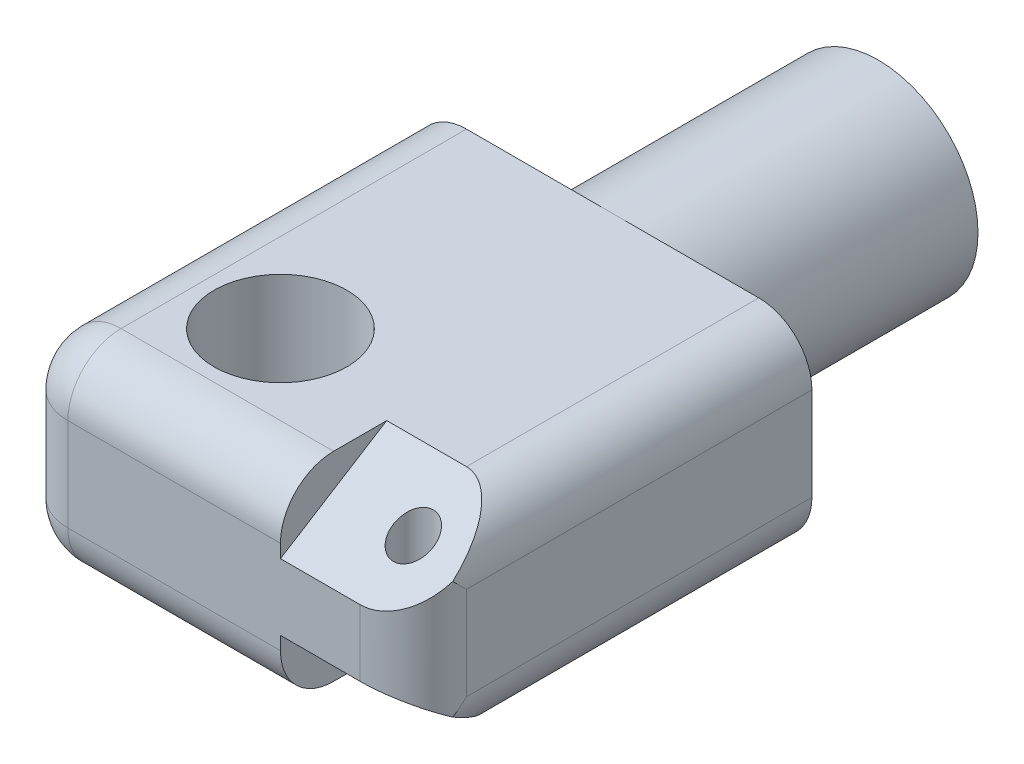
ISO-10303-21;
HEADER;
FILE_DESCRIPTION(('STEP AP214'),'2;1');
FILE_NAME('part.step','',(''),(''),'','','');
FILE_SCHEMA(('AUTOMOTIVE_DESIGN { 1 0 10303 214 1 1 1 1 }'));
ENDSEC;
DATA;
#1=APPLICATION_CONTEXT('core data for automotive mechanical design processes');
#2=APPLICATION_PROTOCOL_DEFINITION('international standard','automotive_design',2000,#1);
#3=PRODUCT_CONTEXT('',#1,'mechanical');
#4=PRODUCT('Part','Part','',(#3));
#5=PRODUCT_RELATED_PRODUCT_CATEGORY('part','',(#4));
#6=PRODUCT_DEFINITION_FORMATION('','',#4);
#7=PRODUCT_DEFINITION_CONTEXT('part definition',#1,'design');
#8=PRODUCT_DEFINITION('design','',#6,#7);
#9=PRODUCT_DEFINITION_SHAPE('','',#8);
#10=(LENGTH_UNIT() NAMED_UNIT(*) SI_UNIT(.MILLI.,.METRE.));
#11=(NAMED_UNIT(*) PLANE_ANGLE_UNIT() SI_UNIT($,.RADIAN.));
#12=(NAMED_UNIT(*) SI_UNIT($,.STERADIAN.) SOLID_ANGLE_UNIT());
#13=UNCERTAINTY_MEASURE_WITH_UNIT(LENGTH_MEASURE(1.E-05),#10,'distance_accuracy_value','');
#14=(GEOMETRIC_REPRESENTATION_CONTEXT(3) GLOBAL_UNCERTAINTY_ASSIGNED_CONTEXT((#13)) GLOBAL_UNIT_ASSIGNED_CONTEXT((#10,
#11,#12)) REPRESENTATION_CONTEXT('',''));
#15=CARTESIAN_POINT('',(0.,0.,0.));
#16=DIRECTION('',(0.,0.,1.));
#17=DIRECTION('',(1.,0.,0.));
#18=AXIS2_PLACEMENT_3D('',#15,#16,#17);
#19=CARTESIAN_POINT('',(10.,7.5,-10.));
#20=DIRECTION('',(0.,0.,1.));
#21=DIRECTION('',(1.,0.,0.));
#22=AXIS2_PLACEMENT_3D('',#19,#20,#21);
#23=PLANE('',#22);
#24=DIRECTION('',(0.,-1.,0.));
#25=VECTOR('',#24,1.);
#26=CARTESIAN_POINT('',(10.,7.5,-10.));
#27=LINE('',#26,#25);
#28=CARTESIAN_POINT('',(10.,5.5,-10.));
#29=VERTEX_POINT('',#28);
#30=CARTESIAN_POINT('',(10.,2.,-10.));
#31=VERTEX_POINT('',#30);
#32=EDGE_CURVE('E214',#29,#31,#27,.T.);
#33=ORIENTED_EDGE('',*,*,#32,.T.);
#34=CARTESIAN_POINT('',(8.,2.,-10.));
#35=DIRECTION('',(0.,0.,1.));
#36=DIRECTION('',(1.,0.,0.));
#37=AXIS2_PLACEMENT_3D('',#34,#35,#36);
#38=CIRCLE('',#37,2.);
#39=CARTESIAN_POINT('',(8.,0.,-10.));
#40=VERTEX_POINT('',#39);
#41=EDGE_CURVE('E42',#31,#40,#38,.F.);
#42=ORIENTED_EDGE('',*,*,#41,.T.);
#43=DIRECTION('',(-1.,0.,0.));
#44=VECTOR('',#43,1.);
#45=CARTESIAN_POINT('',(10.,0.,-10.));
#46=LINE('',#45,#44);
#47=CARTESIAN_POINT('',(2.5,0.,-10.));
#48=VERTEX_POINT('',#47);
#49=EDGE_CURVE('E210',#40,#48,#46,.T.);
#50=ORIENTED_EDGE('',*,*,#49,.T.);
#51=CARTESIAN_POINT('',(2.5,3.75,-10.));
#52=DIRECTION('',(0.,0.,-1.));
#53=DIRECTION('',(-1.,0.,0.));
#54=AXIS2_PLACEMENT_3D('',#51,#52,#53);
#55=CIRCLE('',#54,3.75);
#56=CARTESIAN_POINT('',(2.5,7.5,-10.));
#57=VERTEX_POINT('',#56);
#58=EDGE_CURVE('E196',#57,#48,#55,.T.);
#59=ORIENTED_EDGE('',*,*,#58,.F.);
#60=DIRECTION('',(-1.,0.,0.));
#61=VECTOR('',#60,1.);
#62=CARTESIAN_POINT('',(10.,7.5,-10.));
#63=LINE('',#62,#61);
#64=CARTESIAN_POINT('',(8.,7.5,-10.));
#65=VERTEX_POINT('',#64);
#66=EDGE_CURVE('E206',#65,#57,#63,.T.);
#67=ORIENTED_EDGE('',*,*,#66,.F.);
#68=CARTESIAN_POINT('',(8.,5.5,-10.));
#69=DIRECTION('',(0.,0.,1.));
#70=DIRECTION('',(1.,0.,0.));
#71=AXIS2_PLACEMENT_3D('',#68,#69,#70);
#72=CIRCLE('',#71,2.);
#73=EDGE_CURVE('E265',#65,#29,#72,.F.);
#74=ORIENTED_EDGE('',*,*,#73,.T.);
#75=EDGE_LOOP('',(#33,#42,#50,#59,#67,#74));
#76=FACE_BOUND('',#75,.T.);
#77=ADVANCED_FACE('F33',(#76),#23,.F.);
#78=CARTESIAN_POINT('',(-3.,0.,-10.));
#79=VERTEX_POINT('',#78);
#80=EDGE_CURVE('E203',#48,#79,#46,.T.);
#81=ORIENTED_EDGE('',*,*,#80,.T.);
#82=CARTESIAN_POINT('',(-3.,2.,-10.));
#83=DIRECTION('',(0.,0.,1.));
#84=DIRECTION('',(1.,0.,0.));
#85=AXIS2_PLACEMENT_3D('',#82,#83,#84);
#86=CIRCLE('',#85,2.);
#87=CARTESIAN_POINT('',(-5.,2.,-10.));
#88=VERTEX_POINT('',#87);
#89=EDGE_CURVE('E258',#79,#88,#86,.F.);
#90=ORIENTED_EDGE('',*,*,#89,.T.);
#91=DIRECTION('',(0.,-1.,0.));
#92=VECTOR('',#91,1.);
#93=CARTESIAN_POINT('',(-5.,7.5,-10.));
#94=LINE('',#93,#92);
#95=CARTESIAN_POINT('',(-5.,5.5,-10.));
#96=VERTEX_POINT('',#95);
#97=EDGE_CURVE('E208',#96,#88,#94,.T.);
#98=ORIENTED_EDGE('',*,*,#97,.F.);
#99=CARTESIAN_POINT('',(-3.,5.5,-10.));
#100=DIRECTION('',(0.,0.,1.));
#101=DIRECTION('',(1.,0.,0.));
#102=AXIS2_PLACEMENT_3D('',#99,#100,#101);
#103=CIRCLE('',#102,2.);
#104=CARTESIAN_POINT('',(-3.,7.5,-10.));
#105=VERTEX_POINT('',#104);
#106=EDGE_CURVE('E256',#96,#105,#103,.F.);
#107=ORIENTED_EDGE('',*,*,#106,.T.);
#108=EDGE_CURVE('E209',#57,#105,#63,.T.);
#109=ORIENTED_EDGE('',*,*,#108,.F.);
#110=EDGE_CURVE('E199',#48,#57,#55,.T.);
#111=ORIENTED_EDGE('',*,*,#110,.F.);
#112=EDGE_LOOP('',(#81,#90,#98,#107,#109,#111));
#113=FACE_BOUND('',#112,.T.);
#114=ADVANCED_FACE('F343',(#113),#23,.F.);
#115=CARTESIAN_POINT('',(0.,7.5,0.));
#116=DIRECTION('',(0.,1.,0.));
#117=DIRECTION('',(0.,0.,1.));
#118=AXIS2_PLACEMENT_3D('',#115,#116,#117);
#119=PLANE('',#118);
#120=DIRECTION('',(1.,0.,0.));
#121=VECTOR('',#120,1.);
#122=CARTESIAN_POINT('',(5.,7.5,1.));
#123=LINE('',#122,#121);
#124=CARTESIAN_POINT('',(5.,7.5,1.));
#125=VERTEX_POINT('',#124);
#126=CARTESIAN_POINT('',(8.,7.5,1.));
#127=VERTEX_POINT('',#126);
#128=EDGE_CURVE('E186',#125,#127,#123,.T.);
#129=ORIENTED_EDGE('',*,*,#128,.T.);
#130=DIRECTION('',(0.,0.,-1.));
#131=VECTOR('',#130,1.);
#132=CARTESIAN_POINT('',(8.,7.5,-10.));
#133=LINE('',#132,#131);
#134=EDGE_CURVE('E262',#127,#65,#133,.T.);
#135=ORIENTED_EDGE('',*,*,#134,.T.);
#136=ORIENTED_EDGE('',*,*,#66,.T.);
#137=ORIENTED_EDGE('',*,*,#108,.T.);
#138=DIRECTION('',(0.,0.,1.));
#139=VECTOR('',#138,1.);
#140=CARTESIAN_POINT('',(-3.,7.5,5.));
#141=LINE('',#140,#139);
#142=CARTESIAN_POINT('',(-3.,7.5,3.));
#143=VERTEX_POINT('',#142);
#144=EDGE_CURVE('E50',#105,#143,#141,.T.);
#145=ORIENTED_EDGE('',*,*,#144,.T.);
#146=DIRECTION('',(1.,0.,0.));
#147=VECTOR('',#146,1.);
#148=CARTESIAN_POINT('',(5.,7.5,3.));
#149=LINE('',#148,#147);
#150=CARTESIAN_POINT('',(5.,7.5,3.));
#151=VERTEX_POINT('',#150);
#152=EDGE_CURVE('E54',#143,#151,#149,.T.);
#153=ORIENTED_EDGE('',*,*,#152,.T.);
#154=DIRECTION('',(0.,0.,1.));
#155=VECTOR('',#154,1.);
#156=CARTESIAN_POINT('',(5.,7.5,5.));
#157=LINE('',#156,#155);
#158=EDGE_CURVE('E183',#125,#151,#157,.T.);
#159=ORIENTED_EDGE('',*,*,#158,.F.);
#160=EDGE_LOOP('',(#129,#135,#136,#137,#145,#153,#159));
#161=FACE_BOUND('',#160,.T.);
#162=CARTESIAN_POINT('',(0.,7.5,0.));
#163=DIRECTION('',(0.,1.,0.));
#164=DIRECTION('',(0.,0.,1.));
#165=AXIS2_PLACEMENT_3D('',#162,#163,#164);
#166=CIRCLE('',#165,2.5);
#167=CARTESIAN_POINT('',(0.,7.5,2.5));
#168=VERTEX_POINT('',#167);
#169=EDGE_CURVE('E200',#168,#168,#166,.T.);
#170=ORIENTED_EDGE('',*,*,#169,.F.);
#171=EDGE_LOOP('',(#170));
#172=FACE_BOUND('',#171,.T.);
#173=ADVANCED_FACE('F310',(#161,#172),#119,.T.);
#174=CARTESIAN_POINT('',(0.,0.,0.));
#175=DIRECTION('',(0.,1.,0.));
#176=DIRECTION('',(0.,0.,1.));
#177=AXIS2_PLACEMENT_3D('',#174,#175,#176);
#178=PLANE('',#177);
#179=DIRECTION('',(1.,0.,0.));
#180=VECTOR('',#179,1.);
#181=CARTESIAN_POINT('',(0.,0.,3.));
#182=LINE('',#181,#180);
#183=CARTESIAN_POINT('',(5.,0.,3.));
#184=VERTEX_POINT('',#183);
#185=CARTESIAN_POINT('',(-3.,0.,3.));
#186=VERTEX_POINT('',#185);
#187=EDGE_CURVE('E252',#184,#186,#182,.F.);
#188=ORIENTED_EDGE('',*,*,#187,.T.);
#189=DIRECTION('',(0.,0.,1.));
#190=VECTOR('',#189,1.);
#191=CARTESIAN_POINT('',(-3.,0.,0.));
#192=LINE('',#191,#190);
#193=EDGE_CURVE('E254',#186,#79,#192,.F.);
#194=ORIENTED_EDGE('',*,*,#193,.T.);
#195=ORIENTED_EDGE('',*,*,#80,.F.);
#196=ORIENTED_EDGE('',*,*,#49,.F.);
#197=DIRECTION('',(0.,0.,-1.));
#198=VECTOR('',#197,1.);
#199=CARTESIAN_POINT('',(8.,0.,0.));
#200=LINE('',#199,#198);
#201=CARTESIAN_POINT('',(8.,0.,1.));
#202=VERTEX_POINT('',#201);
#203=EDGE_CURVE('E173',#40,#202,#200,.F.);
#204=ORIENTED_EDGE('',*,*,#203,.T.);
#205=DIRECTION('',(1.,0.,0.));
#206=VECTOR('',#205,1.);
#207=CARTESIAN_POINT('',(5.,0.,1.));
#208=LINE('',#207,#206);
#209=CARTESIAN_POINT('',(5.,0.,1.));
#210=VERTEX_POINT('',#209);
#211=EDGE_CURVE('E164',#210,#202,#208,.T.);
#212=ORIENTED_EDGE('',*,*,#211,.F.);
#213=DIRECTION('',(0.,0.,-1.));
#214=VECTOR('',#213,1.);
#215=CARTESIAN_POINT('',(5.,0.,5.));
#216=LINE('',#215,#214);
#217=EDGE_CURVE('E147',#184,#210,#216,.T.);
#218=ORIENTED_EDGE('',*,*,#217,.F.);
#219=EDGE_LOOP('',(#188,#194,#195,#196,#204,#212,#218));
#220=FACE_BOUND('',#219,.T.);
#221=CARTESIAN_POINT('',(0.,0.,0.));
#222=DIRECTION('',(0.,1.,0.));
#223=DIRECTION('',(0.,0.,1.));
#224=AXIS2_PLACEMENT_3D('',#221,#222,#223);
#225=CIRCLE('',#224,2.5);
#226=CARTESIAN_POINT('',(0.,0.,2.5));
#227=VERTEX_POINT('',#226);
#228=EDGE_CURVE('E195',#227,#227,#225,.T.);
#229=ORIENTED_EDGE('',*,*,#228,.T.);
#230=EDGE_LOOP('',(#229));
#231=FACE_BOUND('',#230,.T.);
#232=ADVANCED_FACE('F169',(#220,#231),#178,.F.);
#233=CARTESIAN_POINT('',(-5.,7.5,-10.));
#234=DIRECTION('',(1.,0.,0.));
#235=DIRECTION('',(0.,0.,-1.));
#236=AXIS2_PLACEMENT_3D('',#233,#234,#235);
#237=PLANE('',#236);
#238=ORIENTED_EDGE('',*,*,#97,.T.);
#239=DIRECTION('',(0.,0.,1.));
#240=VECTOR('',#239,1.);
#241=CARTESIAN_POINT('',(-5.,2.,-10.));
#242=LINE('',#241,#240);
#243=CARTESIAN_POINT('',(-5.,2.,3.));
#244=VERTEX_POINT('',#243);
#245=EDGE_CURVE('E249',#88,#244,#242,.T.);
#246=ORIENTED_EDGE('',*,*,#245,.T.);
#247=DIRECTION('',(0.,-1.,0.));
#248=VECTOR('',#247,1.);
#249=CARTESIAN_POINT('',(-5.,7.5,3.));
#250=LINE('',#249,#248);
#251=CARTESIAN_POINT('',(-5.,5.5,3.));
#252=VERTEX_POINT('',#251);
#253=EDGE_CURVE('E247',#244,#252,#250,.F.);
#254=ORIENTED_EDGE('',*,*,#253,.T.);
#255=DIRECTION('',(0.,0.,1.));
#256=VECTOR('',#255,1.);
#257=CARTESIAN_POINT('',(-5.,5.5,-10.));
#258=LINE('',#257,#256);
#259=EDGE_CURVE('E245',#252,#96,#258,.F.);
#260=ORIENTED_EDGE('',*,*,#259,.T.);
#261=EDGE_LOOP('',(#238,#246,#254,#260));
#262=FACE_BOUND('',#261,.T.);
#263=ADVANCED_FACE('F347',(#262),#237,.F.);
#264=CARTESIAN_POINT('',(-5.,7.5,5.));
#265=DIRECTION('',(0.,0.,-1.));
#266=DIRECTION('',(-1.,0.,0.));
#267=AXIS2_PLACEMENT_3D('',#264,#265,#266);
#268=PLANE('',#267);
#269=DIRECTION('',(1.,0.,0.));
#270=VECTOR('',#269,1.);
#271=CARTESIAN_POINT('',(5.,2.5,5.));
#272=LINE('',#271,#270);
#273=CARTESIAN_POINT('',(5.,2.5,5.));
#274=VERTEX_POINT('',#273);
#275=CARTESIAN_POINT('',(8.,2.5,5.));
#276=VERTEX_POINT('',#275);
#277=EDGE_CURVE('E167',#274,#276,#272,.T.);
#278=ORIENTED_EDGE('',*,*,#277,.T.);
#279=DIRECTION('',(0.,-1.,0.));
#280=VECTOR('',#279,1.);
#281=CARTESIAN_POINT('',(8.,7.5,5.));
#282=LINE('',#281,#280);
#283=CARTESIAN_POINT('',(8.,5.,5.));
#284=VERTEX_POINT('',#283);
#285=EDGE_CURVE('E239',#276,#284,#282,.F.);
#286=ORIENTED_EDGE('',*,*,#285,.T.);
#287=DIRECTION('',(1.,0.,0.));
#288=VECTOR('',#287,1.);
#289=CARTESIAN_POINT('',(5.,5.,5.));
#290=LINE('',#289,#288);
#291=CARTESIAN_POINT('',(5.,5.,5.));
#292=VERTEX_POINT('',#291);
#293=EDGE_CURVE('E185',#292,#284,#290,.T.);
#294=ORIENTED_EDGE('',*,*,#293,.F.);
#295=DIRECTION('',(0.,-1.,0.));
#296=VECTOR('',#295,1.);
#297=CARTESIAN_POINT('',(5.,5.,5.));
#298=LINE('',#297,#296);
#299=CARTESIAN_POINT('',(5.,5.5,5.));
#300=VERTEX_POINT('',#299);
#301=EDGE_CURVE('E178',#300,#292,#298,.T.);
#302=ORIENTED_EDGE('',*,*,#301,.F.);
#303=DIRECTION('',(1.,0.,0.));
#304=VECTOR('',#303,1.);
#305=CARTESIAN_POINT('',(-5.,5.5,5.));
#306=LINE('',#305,#304);
#307=CARTESIAN_POINT('',(-3.,5.5,5.));
#308=VERTEX_POINT('',#307);
#309=EDGE_CURVE('E232',#300,#308,#306,.F.);
#310=ORIENTED_EDGE('',*,*,#309,.T.);
#311=DIRECTION('',(0.,-1.,0.));
#312=VECTOR('',#311,1.);
#313=CARTESIAN_POINT('',(-3.,7.5,5.));
#314=LINE('',#313,#312);
#315=CARTESIAN_POINT('',(-3.,2.,5.));
#316=VERTEX_POINT('',#315);
#317=EDGE_CURVE('E234',#308,#316,#314,.T.);
#318=ORIENTED_EDGE('',*,*,#317,.T.);
#319=DIRECTION('',(1.,0.,0.));
#320=VECTOR('',#319,1.);
#321=CARTESIAN_POINT('',(-5.,2.,5.));
#322=LINE('',#321,#320);
#323=CARTESIAN_POINT('',(5.,2.,5.));
#324=VERTEX_POINT('',#323);
#325=EDGE_CURVE('E237',#316,#324,#322,.T.);
#326=ORIENTED_EDGE('',*,*,#325,.T.);
#327=DIRECTION('',(0.,-1.,0.));
#328=VECTOR('',#327,1.);
#329=CARTESIAN_POINT('',(5.,2.5,5.));
#330=LINE('',#329,#328);
#331=EDGE_CURVE('E158',#274,#324,#330,.T.);
#332=ORIENTED_EDGE('',*,*,#331,.F.);
#333=EDGE_LOOP('',(#278,#286,#294,#302,#310,#318,#326,#332));
#334=FACE_BOUND('',#333,.T.);
#335=ADVANCED_FACE('F299',(#334),#268,.F.);
#336=CARTESIAN_POINT('',(10.,7.5,5.));
#337=DIRECTION('',(-1.,0.,0.));
#338=DIRECTION('',(0.,0.,1.));
#339=AXIS2_PLACEMENT_3D('',#336,#337,#338);
#340=PLANE('',#339);
#341=DIRECTION('',(0.,-1.,0.));
#342=VECTOR('',#341,1.);
#343=CARTESIAN_POINT('',(10.,7.5,3.));
#344=LINE('',#343,#342);
#345=CARTESIAN_POINT('',(10.,5.5,3.));
#346=VERTEX_POINT('',#345);
#347=CARTESIAN_POINT('',(10.,2.,3.));
#348=VERTEX_POINT('',#347);
#349=EDGE_CURVE('E223',#346,#348,#344,.T.);
#350=ORIENTED_EDGE('',*,*,#349,.T.);
#351=DIRECTION('',(0.,0.,-1.));
#352=VECTOR('',#351,1.);
#353=CARTESIAN_POINT('',(10.,2.,5.));
#354=LINE('',#353,#352);
#355=EDGE_CURVE('E226',#348,#31,#354,.T.);
#356=ORIENTED_EDGE('',*,*,#355,.T.);
#357=ORIENTED_EDGE('',*,*,#32,.F.);
#358=DIRECTION('',(0.,0.,-1.));
#359=VECTOR('',#358,1.);
#360=CARTESIAN_POINT('',(10.,5.5,1.));
#361=LINE('',#360,#359);
#362=EDGE_CURVE('E221',#29,#346,#361,.F.);
#363=ORIENTED_EDGE('',*,*,#362,.T.);
#364=EDGE_LOOP('',(#350,#356,#357,#363));
#365=FACE_BOUND('',#364,.T.);
#366=ADVANCED_FACE('F326',(#365),#340,.F.);
#367=CARTESIAN_POINT('',(0.,7.5,0.));
#368=DIRECTION('',(0.,-1.,0.));
#369=DIRECTION('',(0.,0.,-1.));
#370=AXIS2_PLACEMENT_3D('',#367,#368,#369);
#371=CYLINDRICAL_SURFACE('',#370,2.5);
#372=ORIENTED_EDGE('',*,*,#169,.T.);
#373=EDGE_LOOP('',(#372));
#374=FACE_BOUND('',#373,.T.);
#375=ORIENTED_EDGE('',*,*,#228,.F.);
#376=EDGE_LOOP('',(#375));
#377=FACE_BOUND('',#376,.T.);
#378=ADVANCED_FACE('F374',(#374,#377),#371,.F.);
#379=CARTESIAN_POINT('',(2.5,3.75,-20.));
#380=DIRECTION('',(0.,0.,1.));
#381=DIRECTION('',(1.,0.,0.));
#382=AXIS2_PLACEMENT_3D('',#379,#380,#381);
#383=CYLINDRICAL_SURFACE('',#382,3.75);
#384=CARTESIAN_POINT('',(2.5,3.75,-20.));
#385=DIRECTION('',(0.,0.,-1.));
#386=DIRECTION('',(-1.,0.,0.));
#387=AXIS2_PLACEMENT_3D('',#384,#385,#386);
#388=CIRCLE('',#387,3.75);
#389=CARTESIAN_POINT('',(-1.25,3.75,-20.));
#390=VERTEX_POINT('',#389);
#391=EDGE_CURVE('E192',#390,#390,#388,.T.);
#392=ORIENTED_EDGE('',*,*,#391,.F.);
#393=EDGE_LOOP('',(#392));
#394=FACE_BOUND('',#393,.T.);
#395=ORIENTED_EDGE('',*,*,#58,.T.);
#396=ORIENTED_EDGE('',*,*,#110,.T.);
#397=EDGE_LOOP('',(#395,#396));
#398=FACE_BOUND('',#397,.T.);
#399=ADVANCED_FACE('F341',(#394,#398),#383,.T.);
#400=CARTESIAN_POINT('',(2.5,3.75,-20.));
#401=DIRECTION('',(0.,0.,-1.));
#402=DIRECTION('',(-1.,0.,0.));
#403=AXIS2_PLACEMENT_3D('',#400,#401,#402);
#404=PLANE('',#403);
#405=ORIENTED_EDGE('',*,*,#391,.T.);
#406=EDGE_LOOP('',(#405));
#407=FACE_BOUND('',#406,.T.);
#408=ADVANCED_FACE('F483',(#407),#404,.T.);
#409=CARTESIAN_POINT('',(8.,0.,3.));
#410=DIRECTION('',(0.,1.,0.));
#411=DIRECTION('',(0.,0.,1.));
#412=AXIS2_PLACEMENT_3D('',#409,#410,#411);
#413=CYLINDRICAL_SURFACE('',#412,0.75);
#414=CARTESIAN_POINT('',(8.,1.25,3.));
#415=DIRECTION('',(0.,0.847998304005088,-0.52999894000318));
#416=DIRECTION('',(0.,0.52999894000318,0.847998304005088));
#417=AXIS2_PLACEMENT_3D('',#414,#415,#416);
#418=ELLIPSE('',#417,0.884435731130307,0.75);
#419=CARTESIAN_POINT('',(8.,1.71875,3.75));
#420=VERTEX_POINT('',#419);
#421=EDGE_CURVE('E175',#420,#420,#418,.F.);
#422=ORIENTED_EDGE('',*,*,#421,.T.);
#423=EDGE_LOOP('',(#422));
#424=FACE_BOUND('',#423,.T.);
#425=CARTESIAN_POINT('',(8.,6.25,3.));
#426=DIRECTION('',(0.,-0.847998304005088,-0.52999894000318));
#427=DIRECTION('',(0.,0.52999894000318,-0.847998304005088));
#428=AXIS2_PLACEMENT_3D('',#425,#426,#427);
#429=ELLIPSE('',#428,0.884435731130307,0.75);
#430=CARTESIAN_POINT('',(8.,6.71875,2.25));
#431=VERTEX_POINT('',#430);
#432=EDGE_CURVE('E189',#431,#431,#429,.F.);
#433=ORIENTED_EDGE('',*,*,#432,.T.);
#434=EDGE_LOOP('',(#433));
#435=FACE_BOUND('',#434,.T.);
#436=ADVANCED_FACE('F474',(#424,#435),#413,.F.);
#437=CARTESIAN_POINT('',(5.,7.5,1.));
#438=DIRECTION('',(0.,-0.847998304005088,-0.52999894000318));
#439=DIRECTION('',(0.,0.52999894000318,-0.847998304005088));
#440=AXIS2_PLACEMENT_3D('',#437,#438,#439);
#441=PLANE('',#440);
#442=ORIENTED_EDGE('',*,*,#293,.T.);
#443=CARTESIAN_POINT('',(8.,6.25,3.));
#444=DIRECTION('',(0.,-0.847998304005088,-0.52999894000318));
#445=DIRECTION('',(0.,-0.52999894000318,0.847998304005088));
#446=AXIS2_PLACEMENT_3D('',#443,#444,#445);
#447=ELLIPSE('',#446,2.35849528301415,2.);
#448=CARTESIAN_POINT('',(9.94601702164208,5.96153846153846,3.46153846153846));
#449=VERTEX_POINT('',#448);
#450=EDGE_CURVE('E243',#284,#449,#447,.F.);
#451=ORIENTED_EDGE('',*,*,#450,.T.);
#452=CARTESIAN_POINT('',(8.,5.5,4.2));
#453=DIRECTION('',(0.,-0.847998304005088,-0.52999894000318));
#454=DIRECTION('',(0.,-0.52999894000318,0.847998304005088));
#455=AXIS2_PLACEMENT_3D('',#452,#453,#454);
#456=ELLIPSE('',#455,3.77359245282264,2.);
#457=EDGE_CURVE('E241',#449,#127,#456,.F.);
#458=ORIENTED_EDGE('',*,*,#457,.T.);
#459=ORIENTED_EDGE('',*,*,#128,.F.);
#460=DIRECTION('',(0.,0.52999894000318,-0.847998304005088));
#461=VECTOR('',#460,1.);
#462=CARTESIAN_POINT('',(5.,7.5,1.));
#463=LINE('',#462,#461);
#464=EDGE_CURVE('E180',#292,#125,#463,.T.);
#465=ORIENTED_EDGE('',*,*,#464,.F.);
#466=EDGE_LOOP('',(#442,#451,#458,#459,#465));
#467=FACE_BOUND('',#466,.T.);
#468=ORIENTED_EDGE('',*,*,#432,.F.);
#469=EDGE_LOOP('',(#468));
#470=FACE_BOUND('',#469,.T.);
#471=ADVANCED_FACE('F466',(#467,#470),#441,.F.);
#472=CARTESIAN_POINT('',(5.,0.,0.));
#473=DIRECTION('',(-1.,0.,0.));
#474=DIRECTION('',(0.,0.,1.));
#475=AXIS2_PLACEMENT_3D('',#472,#473,#474);
#476=PLANE('',#475);
#477=ORIENTED_EDGE('',*,*,#158,.T.);
#478=CARTESIAN_POINT('',(5.,5.5,3.));
#479=DIRECTION('',(-1.,0.,0.));
#480=DIRECTION('',(0.,0.,1.));
#481=AXIS2_PLACEMENT_3D('',#478,#479,#480);
#482=CIRCLE('',#481,2.);
#483=EDGE_CURVE('E11',#151,#300,#482,.F.);
#484=ORIENTED_EDGE('',*,*,#483,.T.);
#485=ORIENTED_EDGE('',*,*,#301,.T.);
#486=ORIENTED_EDGE('',*,*,#464,.T.);
#487=EDGE_LOOP('',(#477,#484,#485,#486));
#488=FACE_BOUND('',#487,.T.);
#489=ADVANCED_FACE('F308',(#488),#476,.F.);
#490=CARTESIAN_POINT('',(5.,0.,1.));
#491=DIRECTION('',(0.,0.847998304005088,-0.52999894000318));
#492=DIRECTION('',(0.,0.52999894000318,0.847998304005088));
#493=AXIS2_PLACEMENT_3D('',#490,#491,#492);
#494=PLANE('',#493);
#495=CARTESIAN_POINT('',(8.,2.,4.2));
#496=DIRECTION('',(0.,0.847998304005088,-0.52999894000318));
#497=DIRECTION('',(0.,-0.52999894000318,-0.847998304005088));
#498=AXIS2_PLACEMENT_3D('',#495,#496,#497);
#499=ELLIPSE('',#498,3.77359245282264,2.);
#500=CARTESIAN_POINT('',(9.94601702164208,1.53846153846154,3.46153846153846));
#501=VERTEX_POINT('',#500);
#502=EDGE_CURVE('E228',#202,#501,#499,.F.);
#503=ORIENTED_EDGE('',*,*,#502,.T.);
#504=CARTESIAN_POINT('',(8.,1.25,3.));
#505=DIRECTION('',(0.,0.847998304005088,-0.52999894000318));
#506=DIRECTION('',(0.,-0.52999894000318,-0.847998304005088));
#507=AXIS2_PLACEMENT_3D('',#504,#505,#506);
#508=ELLIPSE('',#507,2.35849528301415,2.);
#509=EDGE_CURVE('E230',#501,#276,#508,.F.);
#510=ORIENTED_EDGE('',*,*,#509,.T.);
#511=ORIENTED_EDGE('',*,*,#277,.F.);
#512=DIRECTION('',(0.,0.52999894000318,0.847998304005088));
#513=VECTOR('',#512,1.);
#514=CARTESIAN_POINT('',(5.,0.,1.));
#515=LINE('',#514,#513);
#516=EDGE_CURVE('E151',#210,#274,#515,.T.);
#517=ORIENTED_EDGE('',*,*,#516,.F.);
#518=ORIENTED_EDGE('',*,*,#211,.T.);
#519=EDGE_LOOP('',(#503,#510,#511,#517,#518));
#520=FACE_BOUND('',#519,.T.);
#521=ORIENTED_EDGE('',*,*,#421,.F.);
#522=EDGE_LOOP('',(#521));
#523=FACE_BOUND('',#522,.T.);
#524=ADVANCED_FACE('F162',(#520,#523),#494,.F.);
#525=CARTESIAN_POINT('',(5.,0.,0.));
#526=DIRECTION('',(1.,0.,0.));
#527=DIRECTION('',(0.,0.,-1.));
#528=AXIS2_PLACEMENT_3D('',#525,#526,#527);
#529=PLANE('',#528);
#530=ORIENTED_EDGE('',*,*,#331,.T.);
#531=CARTESIAN_POINT('',(5.,2.,3.));
#532=DIRECTION('',(1.,0.,0.));
#533=DIRECTION('',(0.,0.,-1.));
#534=AXIS2_PLACEMENT_3D('',#531,#532,#533);
#535=CIRCLE('',#534,2.);
#536=EDGE_CURVE('E154',#324,#184,#535,.T.);
#537=ORIENTED_EDGE('',*,*,#536,.T.);
#538=ORIENTED_EDGE('',*,*,#217,.T.);
#539=ORIENTED_EDGE('',*,*,#516,.T.);
#540=EDGE_LOOP('',(#530,#537,#538,#539));
#541=FACE_BOUND('',#540,.T.);
#542=ADVANCED_FACE('F150',(#541),#529,.T.);
#543=CARTESIAN_POINT('',(8.,5.5,0.));
#544=DIRECTION('',(0.,0.,1.));
#545=DIRECTION('',(1.,0.,0.));
#546=AXIS2_PLACEMENT_3D('',#543,#544,#545);
#547=CYLINDRICAL_SURFACE('',#546,2.);
#548=ORIENTED_EDGE('',*,*,#134,.F.);
#549=ORIENTED_EDGE('',*,*,#457,.F.);
#550=CARTESIAN_POINT('',(8.,5.5,3.));
#551=DIRECTION('',(0.,-0.707106781186547,0.707106781186547));
#552=DIRECTION('',(0.,-0.707106781186547,-0.707106781186547));
#553=AXIS2_PLACEMENT_3D('',#550,#551,#552);
#554=ELLIPSE('',#553,2.82842712474619,2.);
#555=EDGE_CURVE('E270',#346,#449,#554,.T.);
#556=ORIENTED_EDGE('',*,*,#555,.F.);
#557=ORIENTED_EDGE('',*,*,#362,.F.);
#558=ORIENTED_EDGE('',*,*,#73,.F.);
#559=EDGE_LOOP('',(#548,#549,#556,#557,#558));
#560=FACE_BOUND('',#559,.T.);
#561=ADVANCED_FACE('F318',(#560),#547,.T.);
#562=CARTESIAN_POINT('',(8.,2.,5.));
#563=DIRECTION('',(0.,0.,-1.));
#564=DIRECTION('',(-1.,0.,0.));
#565=AXIS2_PLACEMENT_3D('',#562,#563,#564);
#566=CYLINDRICAL_SURFACE('',#565,2.);
#567=ORIENTED_EDGE('',*,*,#41,.F.);
#568=ORIENTED_EDGE('',*,*,#355,.F.);
#569=CARTESIAN_POINT('',(8.,2.,3.));
#570=DIRECTION('',(0.,-0.707106781186547,-0.707106781186547));
#571=DIRECTION('',(0.,0.707106781186547,-0.707106781186547));
#572=AXIS2_PLACEMENT_3D('',#569,#570,#571);
#573=ELLIPSE('',#572,2.82842712474619,2.);
#574=EDGE_CURVE('E268',#501,#348,#573,.F.);
#575=ORIENTED_EDGE('',*,*,#574,.F.);
#576=ORIENTED_EDGE('',*,*,#502,.F.);
#577=ORIENTED_EDGE('',*,*,#203,.F.);
#578=EDGE_LOOP('',(#567,#568,#575,#576,#577));
#579=FACE_BOUND('',#578,.T.);
#580=ADVANCED_FACE('F331',(#579),#566,.T.);
#581=CARTESIAN_POINT('',(8.,7.5,3.));
#582=DIRECTION('',(0.,-1.,0.));
#583=DIRECTION('',(0.,0.,-1.));
#584=AXIS2_PLACEMENT_3D('',#581,#582,#583);
#585=CYLINDRICAL_SURFACE('',#584,2.);
#586=ORIENTED_EDGE('',*,*,#450,.F.);
#587=ORIENTED_EDGE('',*,*,#285,.F.);
#588=ORIENTED_EDGE('',*,*,#509,.F.);
#589=ORIENTED_EDGE('',*,*,#574,.T.);
#590=ORIENTED_EDGE('',*,*,#349,.F.);
#591=ORIENTED_EDGE('',*,*,#555,.T.);
#592=EDGE_LOOP('',(#586,#587,#588,#589,#590,#591));
#593=FACE_BOUND('',#592,.T.);
#594=ADVANCED_FACE('F379',(#593),#585,.T.);
#595=CARTESIAN_POINT('',(-3.,5.5,0.));
#596=DIRECTION('',(0.,0.,-1.));
#597=DIRECTION('',(-1.,0.,0.));
#598=AXIS2_PLACEMENT_3D('',#595,#596,#597);
#599=CYLINDRICAL_SURFACE('',#598,2.);
#600=ORIENTED_EDGE('',*,*,#106,.F.);
#601=ORIENTED_EDGE('',*,*,#259,.F.);
#602=CARTESIAN_POINT('',(-3.,5.5,3.));
#603=DIRECTION('',(0.,0.,1.));
#604=DIRECTION('',(1.,0.,0.));
#605=AXIS2_PLACEMENT_3D('',#602,#603,#604);
#606=CIRCLE('',#605,2.);
#607=EDGE_CURVE('E37',#143,#252,#606,.T.);
#608=ORIENTED_EDGE('',*,*,#607,.F.);
#609=ORIENTED_EDGE('',*,*,#144,.F.);
#610=EDGE_LOOP('',(#600,#601,#608,#609));
#611=FACE_BOUND('',#610,.T.);
#612=ADVANCED_FACE('F35',(#611),#599,.T.);
#613=CARTESIAN_POINT('',(0.,5.5,3.));
#614=DIRECTION('',(-1.,0.,0.));
#615=DIRECTION('',(0.,0.,1.));
#616=AXIS2_PLACEMENT_3D('',#613,#614,#615);
#617=CYLINDRICAL_SURFACE('',#616,2.);
#618=ORIENTED_EDGE('',*,*,#483,.F.);
#619=ORIENTED_EDGE('',*,*,#152,.F.);
#620=CARTESIAN_POINT('',(-3.,5.5,3.));
#621=DIRECTION('',(-1.,0.,0.));
#622=DIRECTION('',(0.,0.,1.));
#623=AXIS2_PLACEMENT_3D('',#620,#621,#622);
#624=CIRCLE('',#623,2.);
#625=EDGE_CURVE('E283',#308,#143,#624,.T.);
#626=ORIENTED_EDGE('',*,*,#625,.F.);
#627=ORIENTED_EDGE('',*,*,#309,.F.);
#628=EDGE_LOOP('',(#618,#619,#626,#627));
#629=FACE_BOUND('',#628,.T.);
#630=ADVANCED_FACE('F306',(#629),#617,.T.);
#631=CARTESIAN_POINT('',(-5.,2.,3.));
#632=DIRECTION('',(1.,0.,0.));
#633=DIRECTION('',(0.,0.,-1.));
#634=AXIS2_PLACEMENT_3D('',#631,#632,#633);
#635=CYLINDRICAL_SURFACE('',#634,2.);
#636=ORIENTED_EDGE('',*,*,#536,.F.);
#637=ORIENTED_EDGE('',*,*,#325,.F.);
#638=CARTESIAN_POINT('',(-3.,2.,3.));
#639=DIRECTION('',(-1.,0.,0.));
#640=DIRECTION('',(0.,0.,1.));
#641=AXIS2_PLACEMENT_3D('',#638,#639,#640);
#642=CIRCLE('',#641,2.);
#643=EDGE_CURVE('E281',#186,#316,#642,.T.);
#644=ORIENTED_EDGE('',*,*,#643,.F.);
#645=ORIENTED_EDGE('',*,*,#187,.F.);
#646=EDGE_LOOP('',(#636,#637,#644,#645));
#647=FACE_BOUND('',#646,.T.);
#648=ADVANCED_FACE('F356',(#647),#635,.T.);
#649=CARTESIAN_POINT('',(-3.,2.,-10.));
#650=DIRECTION('',(0.,0.,1.));
#651=DIRECTION('',(1.,0.,0.));
#652=AXIS2_PLACEMENT_3D('',#649,#650,#651);
#653=CYLINDRICAL_SURFACE('',#652,2.);
#654=ORIENTED_EDGE('',*,*,#89,.F.);
#655=ORIENTED_EDGE('',*,*,#193,.F.);
#656=CARTESIAN_POINT('',(-3.,2.,3.));
#657=DIRECTION('',(0.,0.,1.));
#658=DIRECTION('',(1.,0.,0.));
#659=AXIS2_PLACEMENT_3D('',#656,#657,#658);
#660=CIRCLE('',#659,2.);
#661=EDGE_CURVE('E278',#244,#186,#660,.T.);
#662=ORIENTED_EDGE('',*,*,#661,.F.);
#663=ORIENTED_EDGE('',*,*,#245,.F.);
#664=EDGE_LOOP('',(#654,#655,#662,#663));
#665=FACE_BOUND('',#664,.T.);
#666=ADVANCED_FACE('F350',(#665),#653,.T.);
#667=CARTESIAN_POINT('',(-3.,5.5,3.));
#668=DIRECTION('',(0.,0.,1.));
#669=DIRECTION('',(1.,0.,0.));
#670=AXIS2_PLACEMENT_3D('',#667,#668,#669);
#671=SPHERICAL_SURFACE('',#670,2.);
#672=ORIENTED_EDGE('',*,*,#625,.T.);
#673=ORIENTED_EDGE('',*,*,#607,.T.);
#674=CARTESIAN_POINT('',(-3.,5.5,3.));
#675=DIRECTION('',(0.,1.,0.));
#676=DIRECTION('',(0.,0.,1.));
#677=AXIS2_PLACEMENT_3D('',#674,#675,#676);
#678=CIRCLE('',#677,2.);
#679=EDGE_CURVE('E275',#308,#252,#678,.F.);
#680=ORIENTED_EDGE('',*,*,#679,.F.);
#681=EDGE_LOOP('',(#672,#673,#680));
#682=FACE_BOUND('',#681,.T.);
#683=ADVANCED_FACE('F290',(#682),#671,.T.);
#684=CARTESIAN_POINT('',(-3.,2.,3.));
#685=DIRECTION('',(0.,0.,1.));
#686=DIRECTION('',(1.,0.,0.));
#687=AXIS2_PLACEMENT_3D('',#684,#685,#686);
#688=SPHERICAL_SURFACE('',#687,2.);
#689=ORIENTED_EDGE('',*,*,#661,.T.);
#690=ORIENTED_EDGE('',*,*,#643,.T.);
#691=CARTESIAN_POINT('',(-3.,2.,3.));
#692=DIRECTION('',(0.,-1.,0.));
#693=DIRECTION('',(0.,0.,-1.));
#694=AXIS2_PLACEMENT_3D('',#691,#692,#693);
#695=CIRCLE('',#694,2.);
#696=EDGE_CURVE('E273',#244,#316,#695,.F.);
#697=ORIENTED_EDGE('',*,*,#696,.F.);
#698=EDGE_LOOP('',(#689,#690,#697));
#699=FACE_BOUND('',#698,.T.);
#700=ADVANCED_FACE('F354',(#699),#688,.T.);
#701=CARTESIAN_POINT('',(-3.,7.5,3.));
#702=DIRECTION('',(0.,-1.,0.));
#703=DIRECTION('',(0.,0.,-1.));
#704=AXIS2_PLACEMENT_3D('',#701,#702,#703);
#705=CYLINDRICAL_SURFACE('',#704,2.);
#706=ORIENTED_EDGE('',*,*,#679,.T.);
#707=ORIENTED_EDGE('',*,*,#253,.F.);
#708=ORIENTED_EDGE('',*,*,#696,.T.);
#709=ORIENTED_EDGE('',*,*,#317,.F.);
#710=EDGE_LOOP('',(#706,#707,#708,#709));
#711=FACE_BOUND('',#710,.T.);
#712=ADVANCED_FACE('F296',(#711),#705,.T.);
#713=CLOSED_SHELL('',(#77,#114,#173,#232,#263,#335,#366,#378,#399,#408,#436,#471,#489,#524,#542,
#561,#580,#594,#612,#630,#648,#666,#683,#700,#712));
#714=MANIFOLD_SOLID_BREP('B2',#713);
#715=ADVANCED_BREP_SHAPE_REPRESENTATION('',(#18,#714),#14);
#716=SHAPE_DEFINITION_REPRESENTATION(#9,#715);
ENDSEC;
END-ISO-10303-21;
